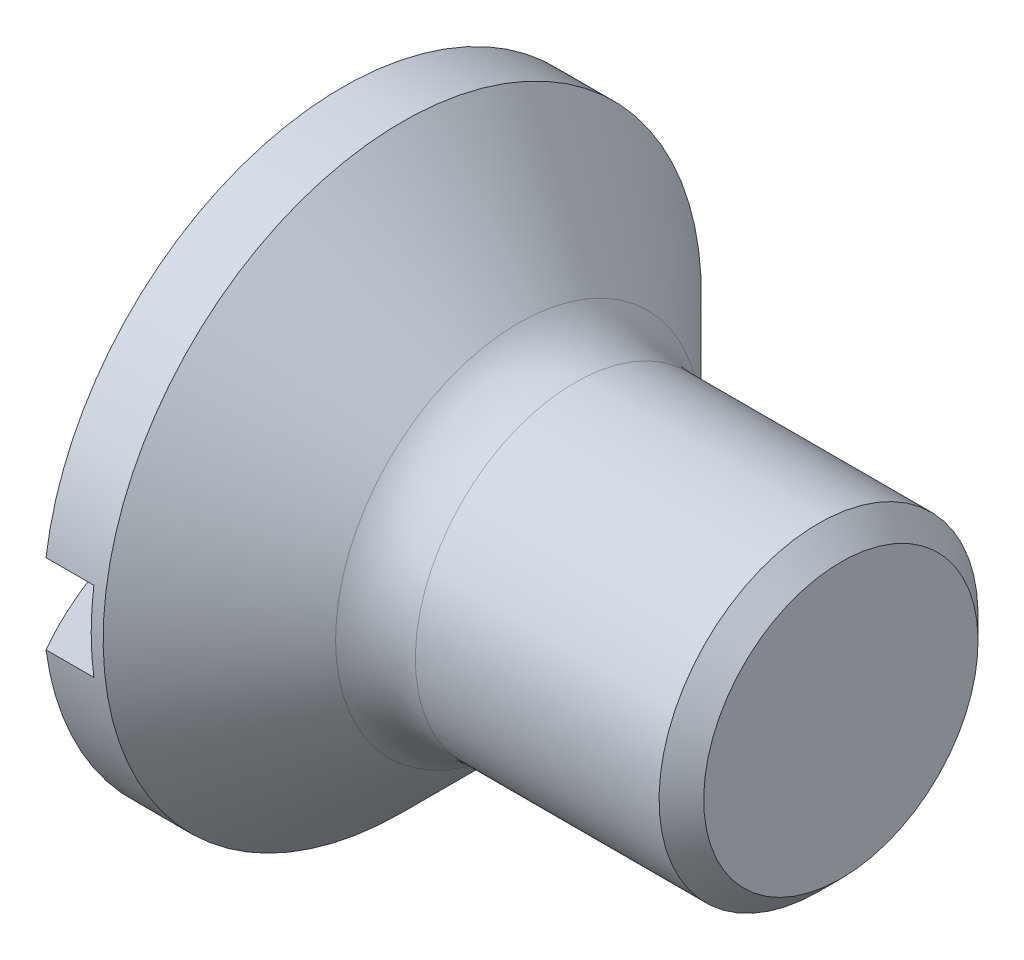
ISO-10303-21;
HEADER;
FILE_DESCRIPTION(('STEP AP214'),'2;1');
FILE_NAME('part.step','',(''),(''),'','','');
FILE_SCHEMA(('AUTOMOTIVE_DESIGN { 1 0 10303 214 1 1 1 1 }'));
ENDSEC;
DATA;
#1=APPLICATION_CONTEXT('core data for automotive mechanical design processes');
#2=APPLICATION_PROTOCOL_DEFINITION('international standard','automotive_design',2000,#1);
#3=PRODUCT_CONTEXT('',#1,'mechanical');
#4=PRODUCT('Part','Part','',(#3));
#5=PRODUCT_RELATED_PRODUCT_CATEGORY('part','',(#4));
#6=PRODUCT_DEFINITION_FORMATION('','',#4);
#7=PRODUCT_DEFINITION_CONTEXT('part definition',#1,'design');
#8=PRODUCT_DEFINITION('design','',#6,#7);
#9=PRODUCT_DEFINITION_SHAPE('','',#8);
#10=(LENGTH_UNIT() NAMED_UNIT(*) SI_UNIT(.MILLI.,.METRE.));
#11=(NAMED_UNIT(*) PLANE_ANGLE_UNIT() SI_UNIT($,.RADIAN.));
#12=(NAMED_UNIT(*) SI_UNIT($,.STERADIAN.) SOLID_ANGLE_UNIT());
#13=UNCERTAINTY_MEASURE_WITH_UNIT(LENGTH_MEASURE(1.E-05),#10,'distance_accuracy_value','');
#14=(GEOMETRIC_REPRESENTATION_CONTEXT(3) GLOBAL_UNCERTAINTY_ASSIGNED_CONTEXT((#13)) GLOBAL_UNIT_ASSIGNED_CONTEXT((#10,
#11,#12)) REPRESENTATION_CONTEXT('',''));
#15=CARTESIAN_POINT('',(0.,0.,0.));
#16=DIRECTION('',(0.,0.,1.));
#17=DIRECTION('',(1.,0.,0.));
#18=AXIS2_PLACEMENT_3D('',#15,#16,#17);
#19=CARTESIAN_POINT('',(3.0125,0.,0.));
#20=DIRECTION('',(-1.,0.,0.));
#21=DIRECTION('',(0.,1.,0.));
#22=AXIS2_PLACEMENT_3D('',#19,#20,#21);
#23=SPHERICAL_SURFACE('',#22,3.0125);
#24=CARTESIAN_POINT('',(0.4,0.,0.));
#25=DIRECTION('',(-1.,0.,0.));
#26=DIRECTION('',(0.,-1.,0.));
#27=AXIS2_PLACEMENT_3D('',#24,#25,#26);
#28=CIRCLE('',#27,1.5);
#29=CARTESIAN_POINT('',(0.4,-0.2,-1.48660687473185));
#30=VERTEX_POINT('',#29);
#31=CARTESIAN_POINT('',(0.4,-0.2,1.48660687473185));
#32=VERTEX_POINT('',#31);
#33=EDGE_CURVE('E101',#30,#32,#28,.T.);
#34=ORIENTED_EDGE('',*,*,#33,.T.);
#35=CARTESIAN_POINT('',(3.0125,-0.2,0.));
#36=DIRECTION('',(0.,-1.,0.));
#37=DIRECTION('',(0.,0.,-1.));
#38=AXIS2_PLACEMENT_3D('',#35,#36,#37);
#39=CIRCLE('',#38,3.00585366410276);
#40=EDGE_CURVE('E51',#32,#30,#39,.T.);
#41=ORIENTED_EDGE('',*,*,#40,.T.);
#42=EDGE_LOOP('',(#34,#41));
#43=FACE_BOUND('',#42,.T.);
#44=ADVANCED_FACE('F29',(#43),#23,.T.);
#45=CARTESIAN_POINT('',(0.4,0.2,1.48660687473185));
#46=VERTEX_POINT('',#45);
#47=CARTESIAN_POINT('',(0.4,0.2,-1.48660687473185));
#48=VERTEX_POINT('',#47);
#49=EDGE_CURVE('E103',#46,#48,#28,.T.);
#50=ORIENTED_EDGE('',*,*,#49,.T.);
#51=CARTESIAN_POINT('',(3.0125,0.2,0.));
#52=DIRECTION('',(0.,1.,0.));
#53=DIRECTION('',(0.,0.,1.));
#54=AXIS2_PLACEMENT_3D('',#51,#52,#53);
#55=CIRCLE('',#54,3.00585366410276);
#56=EDGE_CURVE('E89',#48,#46,#55,.T.);
#57=ORIENTED_EDGE('',*,*,#56,.T.);
#58=EDGE_LOOP('',(#50,#57));
#59=FACE_BOUND('',#58,.T.);
#60=ADVANCED_FACE('F31',(#59),#23,.T.);
#61=CARTESIAN_POINT('',(0.,0.,0.));
#62=DIRECTION('',(-1.,0.,0.));
#63=DIRECTION('',(0.,-1.,0.));
#64=AXIS2_PLACEMENT_3D('',#61,#62,#63);
#65=CYLINDRICAL_SURFACE('',#64,1.5);
#66=ORIENTED_EDGE('',*,*,#33,.F.);
#67=DIRECTION('',(-1.,0.,0.));
#68=VECTOR('',#67,1.);
#69=CARTESIAN_POINT('',(0.,-0.2,-1.48660687473185));
#70=LINE('',#69,#68);
#71=CARTESIAN_POINT('',(0.64,-0.2,-1.48660687473185));
#72=VERTEX_POINT('',#71);
#73=EDGE_CURVE('E78',#30,#72,#70,.F.);
#74=ORIENTED_EDGE('',*,*,#73,.T.);
#75=CARTESIAN_POINT('',(0.64,0.,0.));
#76=DIRECTION('',(-1.,0.,0.));
#77=DIRECTION('',(0.,0.,1.));
#78=AXIS2_PLACEMENT_3D('',#75,#76,#77);
#79=CIRCLE('',#78,1.5);
#80=CARTESIAN_POINT('',(0.64,0.2,-1.48660687473185));
#81=VERTEX_POINT('',#80);
#82=EDGE_CURVE('E70',#81,#72,#79,.T.);
#83=ORIENTED_EDGE('',*,*,#82,.F.);
#84=DIRECTION('',(-1.,0.,0.));
#85=VECTOR('',#84,1.);
#86=CARTESIAN_POINT('',(0.,0.2,-1.48660687473185));
#87=LINE('',#86,#85);
#88=EDGE_CURVE('E76',#81,#48,#87,.T.);
#89=ORIENTED_EDGE('',*,*,#88,.T.);
#90=ORIENTED_EDGE('',*,*,#49,.F.);
#91=DIRECTION('',(-1.,0.,0.));
#92=VECTOR('',#91,1.);
#93=CARTESIAN_POINT('',(0.,0.2,1.48660687473185));
#94=LINE('',#93,#92);
#95=CARTESIAN_POINT('',(0.64,0.2,1.48660687473185));
#96=VERTEX_POINT('',#95);
#97=EDGE_CURVE('E105',#46,#96,#94,.F.);
#98=ORIENTED_EDGE('',*,*,#97,.T.);
#99=CARTESIAN_POINT('',(0.64,-0.2,1.48660687473185));
#100=VERTEX_POINT('',#99);
#101=EDGE_CURVE('E82',#100,#96,#79,.T.);
#102=ORIENTED_EDGE('',*,*,#101,.F.);
#103=DIRECTION('',(-1.,0.,0.));
#104=VECTOR('',#103,1.);
#105=CARTESIAN_POINT('',(0.,-0.2,1.48660687473185));
#106=LINE('',#105,#104);
#107=EDGE_CURVE('E80',#100,#32,#106,.T.);
#108=ORIENTED_EDGE('',*,*,#107,.T.);
#109=EDGE_LOOP('',(#66,#74,#83,#89,#90,#98,#102,#108));
#110=FACE_BOUND('',#109,.T.);
#111=CARTESIAN_POINT('',(0.700000000000002,0.,0.));
#112=DIRECTION('',(-1.,0.,0.));
#113=DIRECTION('',(0.,-1.,0.));
#114=AXIS2_PLACEMENT_3D('',#111,#112,#113);
#115=CIRCLE('',#114,1.5);
#116=CARTESIAN_POINT('',(0.700000000000002,-1.5,0.));
#117=VERTEX_POINT('',#116);
#118=EDGE_CURVE('E98',#117,#117,#115,.T.);
#119=ORIENTED_EDGE('',*,*,#118,.T.);
#120=EDGE_LOOP('',(#119));
#121=FACE_BOUND('',#120,.T.);
#122=ADVANCED_FACE('F73',(#110,#121),#65,.T.);
#123=CARTESIAN_POINT('',(1.4,0.,0.));
#124=DIRECTION('',(-1.,0.,0.));
#125=DIRECTION('',(0.,-1.,0.));
#126=AXIS2_PLACEMENT_3D('',#123,#124,#125);
#127=CONICAL_SURFACE('',#126,0.8,0.78539816339745);
#128=CARTESIAN_POINT('',(1.28284271247462,0.,0.));
#129=DIRECTION('',(-1.,0.,0.));
#130=DIRECTION('',(0.,-1.,0.));
#131=AXIS2_PLACEMENT_3D('',#128,#129,#130);
#132=CIRCLE('',#131,0.917157287525382);
#133=CARTESIAN_POINT('',(1.28284271247462,-0.917157287525382,0.));
#134=VERTEX_POINT('',#133);
#135=EDGE_CURVE('E109',#134,#134,#132,.T.);
#136=ORIENTED_EDGE('',*,*,#135,.T.);
#137=EDGE_LOOP('',(#136));
#138=FACE_BOUND('',#137,.T.);
#139=ORIENTED_EDGE('',*,*,#118,.F.);
#140=EDGE_LOOP('',(#139));
#141=FACE_BOUND('',#140,.T.);
#142=ADVANCED_FACE('F153',(#138,#141),#127,.T.);
#143=CARTESIAN_POINT('',(0.,0.,0.));
#144=DIRECTION('',(-1.,0.,0.));
#145=DIRECTION('',(0.,-1.,0.));
#146=AXIS2_PLACEMENT_3D('',#143,#144,#145);
#147=CYLINDRICAL_SURFACE('',#146,0.8);
#148=CARTESIAN_POINT('',(2.788,0.,0.));
#149=DIRECTION('',(-1.,0.,0.));
#150=DIRECTION('',(0.,-1.,0.));
#151=AXIS2_PLACEMENT_3D('',#148,#149,#150);
#152=CIRCLE('',#151,0.8);
#153=CARTESIAN_POINT('',(2.788,-0.8,0.));
#154=VERTEX_POINT('',#153);
#155=EDGE_CURVE('E37',#154,#154,#152,.T.);
#156=ORIENTED_EDGE('',*,*,#155,.T.);
#157=EDGE_LOOP('',(#156));
#158=FACE_BOUND('',#157,.T.);
#159=CARTESIAN_POINT('',(1.56568542494924,0.,0.));
#160=DIRECTION('',(-1.,0.,0.));
#161=DIRECTION('',(0.,-1.,0.));
#162=AXIS2_PLACEMENT_3D('',#159,#160,#161);
#163=CIRCLE('',#162,0.8);
#164=CARTESIAN_POINT('',(1.56568542494924,-0.8,0.));
#165=VERTEX_POINT('',#164);
#166=EDGE_CURVE('E112',#165,#165,#163,.F.);
#167=ORIENTED_EDGE('',*,*,#166,.T.);
#168=EDGE_LOOP('',(#167));
#169=FACE_BOUND('',#168,.T.);
#170=ADVANCED_FACE('F117',(#158,#169),#147,.T.);
#171=CARTESIAN_POINT('',(2.9,0.8,0.));
#172=DIRECTION('',(-1.,0.,0.));
#173=DIRECTION('',(0.,-1.,0.));
#174=AXIS2_PLACEMENT_3D('',#171,#172,#173);
#175=PLANE('',#174);
#176=CARTESIAN_POINT('',(2.9,0.,0.));
#177=DIRECTION('',(-1.,0.,0.));
#178=DIRECTION('',(0.,-1.,0.));
#179=AXIS2_PLACEMENT_3D('',#176,#177,#178);
#180=CIRCLE('',#179,0.687999999999999);
#181=CARTESIAN_POINT('',(2.9,-0.687999999999999,0.));
#182=VERTEX_POINT('',#181);
#183=EDGE_CURVE('E11',#182,#182,#180,.F.);
#184=ORIENTED_EDGE('',*,*,#183,.T.);
#185=EDGE_LOOP('',(#184));
#186=FACE_BOUND('',#185,.T.);
#187=ADVANCED_FACE('F140',(#186),#175,.F.);
#188=CARTESIAN_POINT('',(0.,-0.2,-1.5));
#189=DIRECTION('',(0.,-1.,0.));
#190=DIRECTION('',(0.,0.,-1.));
#191=AXIS2_PLACEMENT_3D('',#188,#189,#190);
#192=PLANE('',#191);
#193=DIRECTION('',(0.,0.,-1.));
#194=VECTOR('',#193,1.);
#195=CARTESIAN_POINT('',(0.64,-0.2,-1.5));
#196=LINE('',#195,#194);
#197=EDGE_CURVE('E44',#100,#72,#196,.T.);
#198=ORIENTED_EDGE('',*,*,#197,.T.);
#199=ORIENTED_EDGE('',*,*,#73,.F.);
#200=ORIENTED_EDGE('',*,*,#40,.F.);
#201=ORIENTED_EDGE('',*,*,#107,.F.);
#202=EDGE_LOOP('',(#198,#199,#200,#201));
#203=FACE_BOUND('',#202,.T.);
#204=ADVANCED_FACE('F138',(#203),#192,.F.);
#205=CARTESIAN_POINT('',(0.,0.2,-1.5));
#206=DIRECTION('',(0.,1.,0.));
#207=DIRECTION('',(0.,0.,1.));
#208=AXIS2_PLACEMENT_3D('',#205,#206,#207);
#209=PLANE('',#208);
#210=DIRECTION('',(0.,0.,1.));
#211=VECTOR('',#210,1.);
#212=CARTESIAN_POINT('',(0.64,0.2,-1.5));
#213=LINE('',#212,#211);
#214=EDGE_CURVE('E86',#81,#96,#213,.T.);
#215=ORIENTED_EDGE('',*,*,#214,.T.);
#216=ORIENTED_EDGE('',*,*,#97,.F.);
#217=ORIENTED_EDGE('',*,*,#56,.F.);
#218=ORIENTED_EDGE('',*,*,#88,.F.);
#219=EDGE_LOOP('',(#215,#216,#217,#218));
#220=FACE_BOUND('',#219,.T.);
#221=ADVANCED_FACE('F85',(#220),#209,.F.);
#222=CARTESIAN_POINT('',(0.64,-0.2,-1.5));
#223=DIRECTION('',(-1.,0.,0.));
#224=DIRECTION('',(0.,0.,1.));
#225=AXIS2_PLACEMENT_3D('',#222,#223,#224);
#226=PLANE('',#225);
#227=ORIENTED_EDGE('',*,*,#214,.F.);
#228=ORIENTED_EDGE('',*,*,#82,.T.);
#229=ORIENTED_EDGE('',*,*,#197,.F.);
#230=ORIENTED_EDGE('',*,*,#101,.T.);
#231=EDGE_LOOP('',(#227,#228,#229,#230));
#232=FACE_BOUND('',#231,.T.);
#233=ADVANCED_FACE('F91',(#232),#226,.T.);
#234=CARTESIAN_POINT('',(1.56568542494924,0.,0.));
#235=DIRECTION('',(-1.,0.,0.));
#236=DIRECTION('',(0.,-1.,0.));
#237=AXIS2_PLACEMENT_3D('',#234,#235,#236);
#238=TOROIDAL_SURFACE('',#237,1.2,0.4);
#239=ORIENTED_EDGE('',*,*,#166,.F.);
#240=EDGE_LOOP('',(#239));
#241=FACE_BOUND('',#240,.T.);
#242=ORIENTED_EDGE('',*,*,#135,.F.);
#243=EDGE_LOOP('',(#242));
#244=FACE_BOUND('',#243,.T.);
#245=ADVANCED_FACE('F122',(#241,#244),#238,.F.);
#246=CARTESIAN_POINT('',(2.788,0.,0.));
#247=DIRECTION('',(-1.,0.,0.));
#248=DIRECTION('',(0.,-1.,0.));
#249=AXIS2_PLACEMENT_3D('',#246,#247,#248);
#250=CONICAL_SURFACE('',#249,0.8,0.785398163397452);
#251=CARTESIAN_POINT('',(2.9,-0.687999999999999,0.));
#252=CARTESIAN_POINT('',(2.89883333333333,-0.689166666666666,0.));
#253=CARTESIAN_POINT('',(2.89766666666667,-0.690333333333332,0.));
#254=CARTESIAN_POINT('',(2.89533333333333,-0.692666666666666,0.));
#255=CARTESIAN_POINT('',(2.89416666666667,-0.693833333333332,0.));
#256=CARTESIAN_POINT('',(2.89183333333333,-0.696166666666666,0.));
#257=CARTESIAN_POINT('',(2.89066666666667,-0.697333333333332,0.));
#258=CARTESIAN_POINT('',(2.88833333333333,-0.699666666666666,0.));
#259=CARTESIAN_POINT('',(2.88716666666667,-0.700833333333332,0.));
#260=CARTESIAN_POINT('',(2.88483333333333,-0.703166666666666,0.));
#261=CARTESIAN_POINT('',(2.88366666666667,-0.704333333333332,0.));
#262=CARTESIAN_POINT('',(2.88133333333333,-0.706666666666666,0.));
#263=CARTESIAN_POINT('',(2.88016666666667,-0.707833333333333,0.));
#264=CARTESIAN_POINT('',(2.87783333333333,-0.710166666666666,0.));
#265=CARTESIAN_POINT('',(2.87666666666667,-0.711333333333333,0.));
#266=CARTESIAN_POINT('',(2.87433333333333,-0.713666666666666,0.));
#267=CARTESIAN_POINT('',(2.87316666666667,-0.714833333333333,0.));
#268=CARTESIAN_POINT('',(2.87083333333333,-0.717166666666666,0.));
#269=CARTESIAN_POINT('',(2.86966666666667,-0.718333333333333,0.));
#270=CARTESIAN_POINT('',(2.86733333333333,-0.720666666666666,0.));
#271=CARTESIAN_POINT('',(2.86616666666667,-0.721833333333333,0.));
#272=CARTESIAN_POINT('',(2.86383333333333,-0.724166666666666,0.));
#273=CARTESIAN_POINT('',(2.86266666666667,-0.725333333333333,0.));
#274=CARTESIAN_POINT('',(2.86033333333333,-0.727666666666666,0.));
#275=CARTESIAN_POINT('',(2.85916666666667,-0.728833333333333,0.));
#276=CARTESIAN_POINT('',(2.85683333333333,-0.731166666666666,0.));
#277=CARTESIAN_POINT('',(2.85566666666667,-0.732333333333333,0.));
#278=CARTESIAN_POINT('',(2.85333333333333,-0.734666666666666,0.));
#279=CARTESIAN_POINT('',(2.85216666666667,-0.735833333333333,0.));
#280=CARTESIAN_POINT('',(2.84983333333333,-0.738166666666666,0.));
#281=CARTESIAN_POINT('',(2.84866666666667,-0.739333333333333,0.));
#282=CARTESIAN_POINT('',(2.84633333333333,-0.741666666666666,0.));
#283=CARTESIAN_POINT('',(2.84516666666667,-0.742833333333333,0.));
#284=CARTESIAN_POINT('',(2.84283333333333,-0.745166666666666,0.));
#285=CARTESIAN_POINT('',(2.84166666666667,-0.746333333333333,0.));
#286=CARTESIAN_POINT('',(2.83933333333333,-0.748666666666666,0.));
#287=CARTESIAN_POINT('',(2.83816666666667,-0.749833333333333,0.));
#288=CARTESIAN_POINT('',(2.83583333333333,-0.752166666666666,0.));
#289=CARTESIAN_POINT('',(2.83466666666667,-0.753333333333333,0.));
#290=CARTESIAN_POINT('',(2.83233333333333,-0.755666666666666,0.));
#291=CARTESIAN_POINT('',(2.83116666666667,-0.756833333333333,0.));
#292=CARTESIAN_POINT('',(2.82883333333333,-0.759166666666666,0.));
#293=CARTESIAN_POINT('',(2.82766666666667,-0.760333333333333,0.));
#294=CARTESIAN_POINT('',(2.82533333333333,-0.762666666666666,0.));
#295=CARTESIAN_POINT('',(2.82416666666667,-0.763833333333333,0.));
#296=CARTESIAN_POINT('',(2.82183333333333,-0.766166666666667,0.));
#297=CARTESIAN_POINT('',(2.82066666666667,-0.767333333333333,0.));
#298=CARTESIAN_POINT('',(2.81833333333333,-0.769666666666666,0.));
#299=CARTESIAN_POINT('',(2.81716666666667,-0.770833333333333,0.));
#300=CARTESIAN_POINT('',(2.81483333333333,-0.773166666666667,0.));
#301=CARTESIAN_POINT('',(2.81366666666667,-0.774333333333333,0.));
#302=CARTESIAN_POINT('',(2.81133333333333,-0.776666666666667,0.));
#303=CARTESIAN_POINT('',(2.81016666666667,-0.777833333333333,0.));
#304=CARTESIAN_POINT('',(2.80783333333333,-0.780166666666667,0.));
#305=CARTESIAN_POINT('',(2.80666666666667,-0.781333333333333,0.));
#306=CARTESIAN_POINT('',(2.80433333333333,-0.783666666666667,0.));
#307=CARTESIAN_POINT('',(2.80316666666667,-0.784833333333333,0.));
#308=CARTESIAN_POINT('',(2.80083333333333,-0.787166666666667,0.));
#309=CARTESIAN_POINT('',(2.79966666666667,-0.788333333333333,0.));
#310=CARTESIAN_POINT('',(2.79733333333333,-0.790666666666667,0.));
#311=CARTESIAN_POINT('',(2.79616666666667,-0.791833333333334,0.));
#312=CARTESIAN_POINT('',(2.79383333333333,-0.794166666666667,0.));
#313=CARTESIAN_POINT('',(2.79266666666667,-0.795333333333334,0.));
#314=CARTESIAN_POINT('',(2.79033333333333,-0.797666666666667,0.));
#315=CARTESIAN_POINT('',(2.78916666666667,-0.798833333333334,0.));
#316=CARTESIAN_POINT('',(2.788,-0.8,0.));
#317=B_SPLINE_CURVE_WITH_KNOTS('',3,(#251,#252,#253,#254,#255,#256,#257,#258,#259,#260,#261,
#262,#263,#264,#265,#266,#267,#268,#269,#270,#271,#272,#273,#274,#275,#276,#277,#278,#279,#280,
#281,#282,#283,#284,#285,#286,#287,#288,#289,#290,#291,#292,#293,#294,#295,#296,#297,#298,#299,
#300,#301,#302,#303,#304,#305,#306,#307,#308,#309,#310,#311,#312,#313,#314,#315,#316),
.UNSPECIFIED.,.F.,.F.,(4,2,2,2,2,2,2,2,2,2,2,2,2,2,2,2,2,2,2,2,2,2,2,2,2,2,2,2,2,2,2,2,4),(0.,
0.00494974746830557,0.00989949493661145,0.0148492424049173,0.0197989898732232,
0.0247487373415292,0.029698484809835,0.0346482322781409,0.0395979797464468,0.0445477272147527,
0.0494974746830585,0.0544472221513644,0.0593969696196703,0.0643467170879762,0.069296464556282,
0.074246212024588,0.0791959594928939,0.0841457069611997,0.0890954544295056,0.0940452018978115,
0.0989949493661174,0.103944696834423,0.108894444302729,0.113844191771035,0.118793939239341,
0.123743686707647,0.128693434175953,0.133643181644259,0.138592929112564,0.14354267658087,
0.148492424049176,0.153442171517482,0.158391918985788),.UNSPECIFIED.);
#318=EDGE_CURVE('BSEAM120',#182,#154,#317,.T.);
#319=ORIENTED_EDGE('',*,*,#183,.F.);
#320=ORIENTED_EDGE('',*,*,#155,.F.);
#321=ORIENTED_EDGE('',*,*,#318,.T.);
#322=ORIENTED_EDGE('',*,*,#318,.F.);
#323=EDGE_LOOP('',(#319,#321,#320,#322));
#324=FACE_BOUND('',#323,.T.);
#325=ADVANCED_FACE('F120',(#324),#250,.T.);
#326=CLOSED_SHELL('',(#44,#60,#122,#142,#170,#187,#204,#221,#233,#245,#325));
#327=MANIFOLD_SOLID_BREP('B2',#326);
#328=ADVANCED_BREP_SHAPE_REPRESENTATION('',(#18,#327),#14);
#329=SHAPE_DEFINITION_REPRESENTATION(#9,#328);
ENDSEC;
END-ISO-10303-21;
